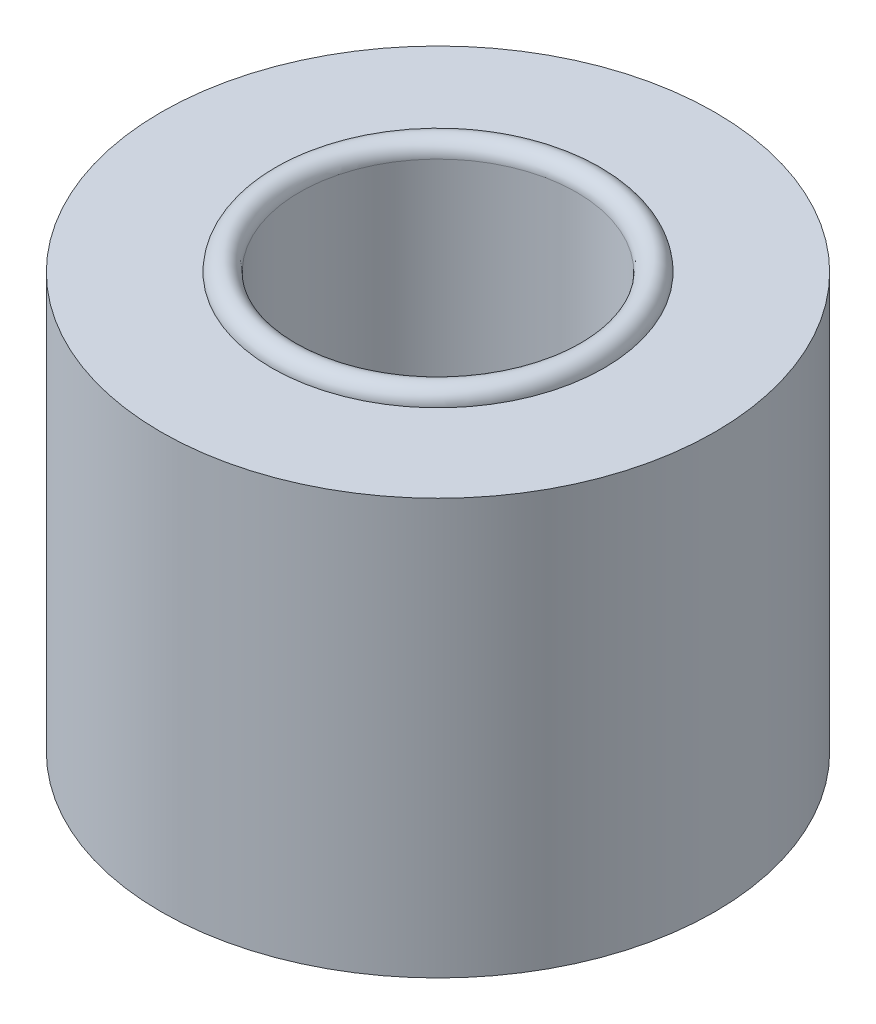
ISO-10303-21;
HEADER;
FILE_DESCRIPTION(('STEP AP214'),'2;1');
FILE_NAME('part.step','',(''),(''),'','','');
FILE_SCHEMA(('AUTOMOTIVE_DESIGN { 1 0 10303 214 1 1 1 1 }'));
ENDSEC;
DATA;
#1=APPLICATION_CONTEXT('core data for automotive mechanical design processes');
#2=APPLICATION_PROTOCOL_DEFINITION('international standard','automotive_design',2000,#1);
#3=PRODUCT_CONTEXT('',#1,'mechanical');
#4=PRODUCT('Part','Part','',(#3));
#5=PRODUCT_RELATED_PRODUCT_CATEGORY('part','',(#4));
#6=PRODUCT_DEFINITION_FORMATION('','',#4);
#7=PRODUCT_DEFINITION_CONTEXT('part definition',#1,'design');
#8=PRODUCT_DEFINITION('design','',#6,#7);
#9=PRODUCT_DEFINITION_SHAPE('','',#8);
#10=(LENGTH_UNIT() NAMED_UNIT(*) SI_UNIT(.MILLI.,.METRE.));
#11=(NAMED_UNIT(*) PLANE_ANGLE_UNIT() SI_UNIT($,.RADIAN.));
#12=(NAMED_UNIT(*) SI_UNIT($,.STERADIAN.) SOLID_ANGLE_UNIT());
#13=UNCERTAINTY_MEASURE_WITH_UNIT(LENGTH_MEASURE(1.E-05),#10,'distance_accuracy_value','');
#14=(GEOMETRIC_REPRESENTATION_CONTEXT(3) GLOBAL_UNCERTAINTY_ASSIGNED_CONTEXT((#13)) GLOBAL_UNIT_ASSIGNED_CONTEXT((#10,
#11,#12)) REPRESENTATION_CONTEXT('',''));
#15=CARTESIAN_POINT('',(0.,0.,0.));
#16=DIRECTION('',(0.,0.,1.));
#17=DIRECTION('',(1.,0.,0.));
#18=AXIS2_PLACEMENT_3D('',#15,#16,#17);
#19=CARTESIAN_POINT('',(0.,30.,0.));
#20=DIRECTION('',(0.,1.,0.));
#21=DIRECTION('',(0.,0.,1.));
#22=AXIS2_PLACEMENT_3D('',#19,#20,#21);
#23=TOROIDAL_SURFACE('',#22,11.,1.);
#24=CARTESIAN_POINT('',(0.,30.,0.));
#25=DIRECTION('',(0.,1.,0.));
#26=DIRECTION('',(0.,0.,1.));
#27=AXIS2_PLACEMENT_3D('',#24,#25,#26);
#28=CIRCLE('',#27,12.);
#29=CARTESIAN_POINT('',(0.,30.,12.));
#30=VERTEX_POINT('',#29);
#31=EDGE_CURVE('E53',#30,#30,#28,.T.);
#32=ORIENTED_EDGE('',*,*,#31,.T.);
#33=EDGE_LOOP('',(#32));
#34=FACE_BOUND('',#33,.T.);
#35=CARTESIAN_POINT('',(0.,30.,0.));
#36=DIRECTION('',(0.,1.,0.));
#37=DIRECTION('',(0.,0.,1.));
#38=AXIS2_PLACEMENT_3D('',#35,#36,#37);
#39=CIRCLE('',#38,10.);
#40=CARTESIAN_POINT('',(0.,30.,10.));
#41=VERTEX_POINT('',#40);
#42=EDGE_CURVE('E10',#41,#41,#39,.T.);
#43=ORIENTED_EDGE('',*,*,#42,.F.);
#44=EDGE_LOOP('',(#43));
#45=FACE_BOUND('',#44,.T.);
#46=ADVANCED_FACE('F34',(#34,#45),#23,.T.);
#47=CARTESIAN_POINT('',(0.,0.,0.));
#48=DIRECTION('',(0.,1.,0.));
#49=DIRECTION('',(0.,0.,1.));
#50=AXIS2_PLACEMENT_3D('',#47,#48,#49);
#51=TOROIDAL_SURFACE('',#50,11.,1.);
#52=CARTESIAN_POINT('',(0.,0.,0.));
#53=DIRECTION('',(0.,1.,0.));
#54=DIRECTION('',(0.,0.,1.));
#55=AXIS2_PLACEMENT_3D('',#52,#53,#54);
#56=CIRCLE('',#55,12.);
#57=CARTESIAN_POINT('',(0.,0.,12.));
#58=VERTEX_POINT('',#57);
#59=EDGE_CURVE('E57',#58,#58,#56,.T.);
#60=ORIENTED_EDGE('',*,*,#59,.F.);
#61=EDGE_LOOP('',(#60));
#62=FACE_BOUND('',#61,.T.);
#63=CARTESIAN_POINT('',(0.,0.,0.));
#64=DIRECTION('',(0.,1.,0.));
#65=DIRECTION('',(0.,0.,1.));
#66=AXIS2_PLACEMENT_3D('',#63,#64,#65);
#67=CIRCLE('',#66,10.);
#68=CARTESIAN_POINT('',(0.,0.,10.));
#69=VERTEX_POINT('',#68);
#70=EDGE_CURVE('E41',#69,#69,#67,.F.);
#71=ORIENTED_EDGE('',*,*,#70,.F.);
#72=EDGE_LOOP('',(#71));
#73=FACE_BOUND('',#72,.T.);
#74=ADVANCED_FACE('F64',(#62,#73),#51,.T.);
#75=CARTESIAN_POINT('',(0.,30.,0.));
#76=DIRECTION('',(0.,1.,0.));
#77=DIRECTION('',(0.,0.,1.));
#78=AXIS2_PLACEMENT_3D('',#75,#76,#77);
#79=PLANE('',#78);
#80=CARTESIAN_POINT('',(0.,30.,0.));
#81=DIRECTION('',(0.,1.,0.));
#82=DIRECTION('',(0.,0.,1.));
#83=AXIS2_PLACEMENT_3D('',#80,#81,#82);
#84=CIRCLE('',#83,20.);
#85=CARTESIAN_POINT('',(0.,30.,20.));
#86=VERTEX_POINT('',#85);
#87=EDGE_CURVE('E45',#86,#86,#84,.T.);
#88=ORIENTED_EDGE('',*,*,#87,.T.);
#89=EDGE_LOOP('',(#88));
#90=FACE_BOUND('',#89,.T.);
#91=ORIENTED_EDGE('',*,*,#31,.F.);
#92=EDGE_LOOP('',(#91));
#93=FACE_BOUND('',#92,.T.);
#94=ADVANCED_FACE('F67',(#90,#93),#79,.T.);
#95=CARTESIAN_POINT('',(0.,0.,0.));
#96=DIRECTION('',(0.,1.,0.));
#97=DIRECTION('',(0.,0.,1.));
#98=AXIS2_PLACEMENT_3D('',#95,#96,#97);
#99=PLANE('',#98);
#100=ORIENTED_EDGE('',*,*,#59,.T.);
#101=EDGE_LOOP('',(#100));
#102=FACE_BOUND('',#101,.T.);
#103=CARTESIAN_POINT('',(0.,0.,0.));
#104=DIRECTION('',(0.,1.,0.));
#105=DIRECTION('',(0.,0.,1.));
#106=AXIS2_PLACEMENT_3D('',#103,#104,#105);
#107=CIRCLE('',#106,20.);
#108=CARTESIAN_POINT('',(0.,0.,20.));
#109=VERTEX_POINT('',#108);
#110=EDGE_CURVE('E49',#109,#109,#107,.T.);
#111=ORIENTED_EDGE('',*,*,#110,.F.);
#112=EDGE_LOOP('',(#111));
#113=FACE_BOUND('',#112,.T.);
#114=ADVANCED_FACE('F61',(#102,#113),#99,.F.);
#115=CARTESIAN_POINT('',(0.,30.,0.));
#116=DIRECTION('',(0.,-1.,0.));
#117=DIRECTION('',(0.,0.,-1.));
#118=AXIS2_PLACEMENT_3D('',#115,#116,#117);
#119=CYLINDRICAL_SURFACE('',#118,20.);
#120=ORIENTED_EDGE('',*,*,#87,.F.);
#121=EDGE_LOOP('',(#120));
#122=FACE_BOUND('',#121,.T.);
#123=ORIENTED_EDGE('',*,*,#110,.T.);
#124=EDGE_LOOP('',(#123));
#125=FACE_BOUND('',#124,.T.);
#126=ADVANCED_FACE('F79',(#122,#125),#119,.T.);
#127=CARTESIAN_POINT('',(0.,30.,0.));
#128=DIRECTION('',(0.,-1.,0.));
#129=DIRECTION('',(0.,0.,-1.));
#130=AXIS2_PLACEMENT_3D('',#127,#128,#129);
#131=CYLINDRICAL_SURFACE('',#130,10.);
#132=ORIENTED_EDGE('',*,*,#42,.T.);
#133=EDGE_LOOP('',(#132));
#134=FACE_BOUND('',#133,.T.);
#135=ORIENTED_EDGE('',*,*,#70,.T.);
#136=EDGE_LOOP('',(#135));
#137=FACE_BOUND('',#136,.T.);
#138=ADVANCED_FACE('F82',(#134,#137),#131,.F.);
#139=CLOSED_SHELL('',(#46,#74,#94,#114,#126,#138));
#140=MANIFOLD_SOLID_BREP('B2',#139);
#141=ADVANCED_BREP_SHAPE_REPRESENTATION('',(#18,#140),#14);
#142=SHAPE_DEFINITION_REPRESENTATION(#9,#141);
ENDSEC;
END-ISO-10303-21;
